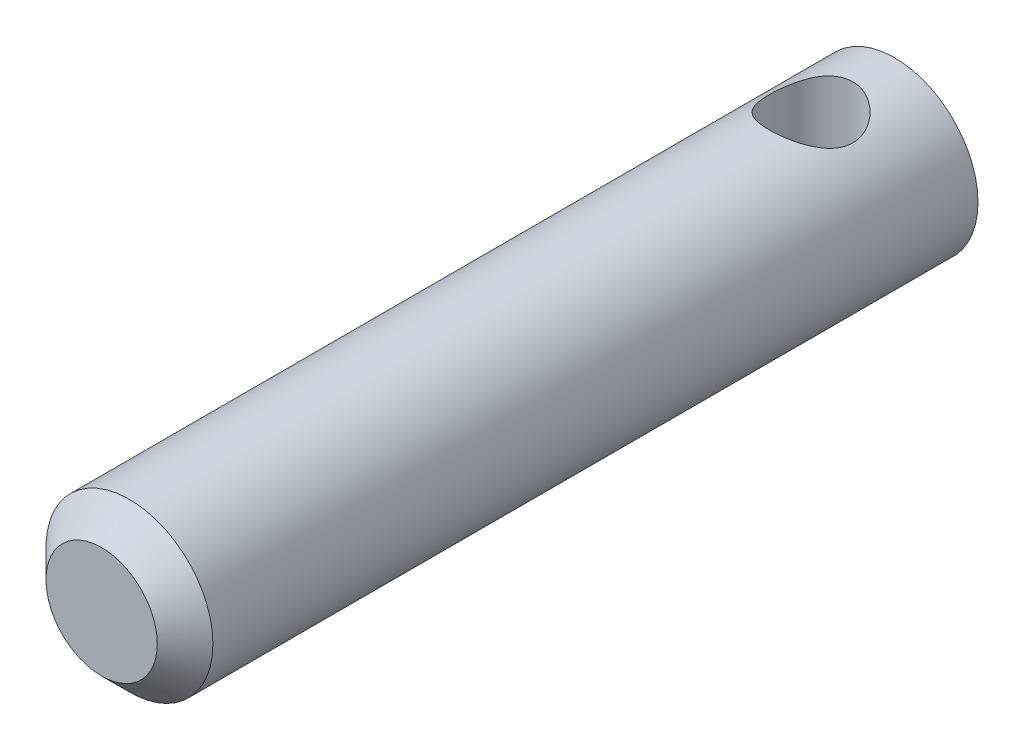
ISO-10303-21;
HEADER;
FILE_DESCRIPTION(('STEP AP214'),'2;1');
FILE_NAME('part.step','',(''),(''),'','','');
FILE_SCHEMA(('AUTOMOTIVE_DESIGN { 1 0 10303 214 1 1 1 1 }'));
ENDSEC;
DATA;
#1=APPLICATION_CONTEXT('core data for automotive mechanical design processes');
#2=APPLICATION_PROTOCOL_DEFINITION('international standard','automotive_design',2000,#1);
#3=PRODUCT_CONTEXT('',#1,'mechanical');
#4=PRODUCT('Part','Part','',(#3));
#5=PRODUCT_RELATED_PRODUCT_CATEGORY('part','',(#4));
#6=PRODUCT_DEFINITION_FORMATION('','',#4);
#7=PRODUCT_DEFINITION_CONTEXT('part definition',#1,'design');
#8=PRODUCT_DEFINITION('design','',#6,#7);
#9=PRODUCT_DEFINITION_SHAPE('','',#8);
#10=(LENGTH_UNIT() NAMED_UNIT(*) SI_UNIT(.MILLI.,.METRE.));
#11=(NAMED_UNIT(*) PLANE_ANGLE_UNIT() SI_UNIT($,.RADIAN.));
#12=(NAMED_UNIT(*) SI_UNIT($,.STERADIAN.) SOLID_ANGLE_UNIT());
#13=UNCERTAINTY_MEASURE_WITH_UNIT(LENGTH_MEASURE(1.E-05),#10,'distance_accuracy_value','');
#14=(GEOMETRIC_REPRESENTATION_CONTEXT(3) GLOBAL_UNCERTAINTY_ASSIGNED_CONTEXT((#13)) GLOBAL_UNIT_ASSIGNED_CONTEXT((#10,
#11,#12)) REPRESENTATION_CONTEXT('',''));
#15=CARTESIAN_POINT('',(0.,0.,0.));
#16=DIRECTION('',(0.,0.,1.));
#17=DIRECTION('',(1.,0.,0.));
#18=AXIS2_PLACEMENT_3D('',#15,#16,#17);
#19=CARTESIAN_POINT('',(0.,0.,28.5));
#20=DIRECTION('',(0.,0.,-1.));
#21=DIRECTION('',(-1.,0.,0.));
#22=AXIS2_PLACEMENT_3D('',#19,#20,#21);
#23=CYLINDRICAL_SURFACE('',#22,3.);
#24=CARTESIAN_POINT('',(0.,0.,27.5));
#25=DIRECTION('',(0.,0.,1.));
#26=DIRECTION('',(1.,0.,0.));
#27=AXIS2_PLACEMENT_3D('',#24,#25,#26);
#28=CIRCLE('',#27,3.);
#29=CARTESIAN_POINT('',(3.,0.,27.5));
#30=VERTEX_POINT('',#29);
#31=EDGE_CURVE('E10',#30,#30,#28,.F.);
#32=ORIENTED_EDGE('',*,*,#31,.T.);
#33=EDGE_LOOP('',(#32));
#34=FACE_BOUND('',#33,.T.);
#35=CARTESIAN_POINT('',(0.,-3.,4.5));
#36=CARTESIAN_POINT('',(0.0788579444268506,-2.99999570107562,4.49999504652421));
#37=CARTESIAN_POINT('',(0.157809899546344,-2.99685736529635,4.49374489031842));
#38=CARTESIAN_POINT('',(0.313380352903344,-2.98461234055736,4.46902067948769));
#39=CARTESIAN_POINT('',(0.389994130070445,-2.97549431743379,4.45052341050328));
#40=CARTESIAN_POINT('',(0.538400317320674,-2.95224419105063,4.40220928707506));
#41=CARTESIAN_POINT('',(0.61021020440872,-2.93813158766306,4.37243642362805));
#42=CARTESIAN_POINT('',(0.747708925209898,-2.90618664773642,4.30264406795252));
#43=CARTESIAN_POINT('',(0.813398240985089,-2.88835460450288,4.2626253836267));
#44=CARTESIAN_POINT('',(0.941261726642864,-2.84934387387093,4.17072412577207));
#45=CARTESIAN_POINT('',(1.00298281668316,-2.82802798691306,4.11827028114054));
#46=CARTESIAN_POINT('',(1.11716916730047,-2.78489955370115,4.00421778112945));
#47=CARTESIAN_POINT('',(1.16962737466015,-2.76308664313552,3.94261222234134));
#48=CARTESIAN_POINT('',(1.26787800067542,-2.71948426796021,3.80627497571493));
#49=CARTESIAN_POINT('',(1.31283800332746,-2.69782780455198,3.73089585248113));
#50=CARTESIAN_POINT('',(1.38925234033604,-2.65928968158481,3.57244899602068));
#51=CARTESIAN_POINT('',(1.4207163224495,-2.64240461410484,3.48938680691588));
#52=CARTESIAN_POINT('',(1.46719866328288,-2.61686800556713,3.32300234186712));
#53=CARTESIAN_POINT('',(1.48308878562066,-2.6077840737557,3.23999332189891));
#54=CARTESIAN_POINT('',(1.50064048996327,-2.59772834922792,3.07203174333078));
#55=CARTESIAN_POINT('',(1.50231613255961,-2.59674854014932,2.98708118869327));
#56=CARTESIAN_POINT('',(1.49203093075844,-2.60266395385873,2.82857096352695));
#57=CARTESIAN_POINT('',(1.48167683930523,-2.6086314549302,2.75486395316542));
#58=CARTESIAN_POINT('',(1.4504097735854,-2.62614343100775,2.61041713594044));
#59=CARTESIAN_POINT('',(1.42949343584648,-2.63768968247664,2.53967828204203));
#60=CARTESIAN_POINT('',(1.37731467057901,-2.66531214619112,2.40115630115151));
#61=CARTESIAN_POINT('',(1.34582260067399,-2.68148760995998,2.33348040182132));
#62=CARTESIAN_POINT('',(1.273562531502,-2.71655106422106,2.20404856111499));
#63=CARTESIAN_POINT('',(1.2327903657187,-2.73544027170286,2.14229529659987));
#64=CARTESIAN_POINT('',(1.13709908236918,-2.77669736854929,2.01821812088516));
#65=CARTESIAN_POINT('',(1.08104168755392,-2.79920265355119,1.95681468963576));
#66=CARTESIAN_POINT('',(0.959333368112061,-2.84321434950611,1.84389687211365));
#67=CARTESIAN_POINT('',(0.893677884861429,-2.86472027938201,1.79238721194918));
#68=CARTESIAN_POINT('',(0.750774758747774,-2.90552980924446,1.69847150845541));
#69=CARTESIAN_POINT('',(0.673130387399114,-2.92468476243011,1.65659929133139));
#70=CARTESIAN_POINT('',(0.510699323233196,-2.95736821681863,1.58685445643549));
#71=CARTESIAN_POINT('',(0.425918364397915,-2.9709011841533,1.55897072247725));
#72=CARTESIAN_POINT('',(0.259149737491054,-2.98986500612153,1.52028689442499));
#73=CARTESIAN_POINT('',(0.17751229582249,-2.99587407451965,1.50826314637983));
#74=CARTESIAN_POINT('',(0.0131693999240285,-3.00109520188655,1.49780290329827));
#75=CARTESIAN_POINT('',(-0.0695355298048621,-3.00031048081978,1.4993599715408));
#76=CARTESIAN_POINT('',(-0.226849457978979,-2.99236788380152,1.51531003262812));
#77=CARTESIAN_POINT('',(-0.301589112074894,-2.98570868532253,1.52869879909499));
#78=CARTESIAN_POINT('',(-0.447610338452911,-2.9673325697226,1.56635710784268));
#79=CARTESIAN_POINT('',(-0.51889152853663,-2.95561509501618,1.59062784968024));
#80=CARTESIAN_POINT('',(-0.658332912674359,-2.92776377120382,1.64999769964955));
#81=CARTESIAN_POINT('',(-0.726345595508705,-2.91151322654446,1.68538657517443));
#82=CARTESIAN_POINT('',(-0.855692042548907,-2.87615961476126,1.76566130346985));
#83=CARTESIAN_POINT('',(-0.917022944664887,-2.85705533350407,1.81055120189309));
#84=CARTESIAN_POINT('',(-1.03765153393382,-2.81562332004297,1.91364063799608));
#85=CARTESIAN_POINT('',(-1.09615811672854,-2.79316327265249,1.97271430266772));
#86=CARTESIAN_POINT('',(-1.20278448167828,-2.7489358741323,2.09988772691659));
#87=CARTESIAN_POINT('',(-1.25089707856781,-2.72716901100071,2.16799367827188));
#88=CARTESIAN_POINT('',(-1.33756187171853,-2.68576788309734,2.31546548125946));
#89=CARTESIAN_POINT('',(-1.37553824370037,-2.66628794383591,2.39521689914172));
#90=CARTESIAN_POINT('',(-1.43712423890206,-2.63361108441202,2.56126510136245));
#91=CARTESIAN_POINT('',(-1.46075237380052,-2.62040607332625,2.64755328970033));
#92=CARTESIAN_POINT('',(-1.49079253120031,-2.60342251538703,2.81536533432706));
#93=CARTESIAN_POINT('',(-1.49863949460818,-2.59886075197597,2.89655138015286));
#94=CARTESIAN_POINT('',(-1.5010337315643,-2.59748031962405,3.05917060074679));
#95=CARTESIAN_POINT('',(-1.49558676993486,-2.60065829439585,3.14060365310679));
#96=CARTESIAN_POINT('',(-1.47288918838996,-2.61356793076615,3.29322525230015));
#97=CARTESIAN_POINT('',(-1.45681247151455,-2.62264641723988,3.36465070521711));
#98=CARTESIAN_POINT('',(-1.41476303733662,-2.64556524281479,3.50371217913655));
#99=CARTESIAN_POINT('',(-1.38878713673988,-2.65940711354503,3.57134697313805));
#100=CARTESIAN_POINT('',(-1.32572361795085,-2.69142795546803,3.7059372764798));
#101=CARTESIAN_POINT('',(-1.28800670672355,-2.70983583593881,3.77254185274354));
#102=CARTESIAN_POINT('',(-1.20322645745609,-2.74852997452291,3.89891180427189));
#103=CARTESIAN_POINT('',(-1.15615825686234,-2.76881720693416,3.95867359578167));
#104=CARTESIAN_POINT('',(-1.04730498999206,-2.81193484737138,4.07721297353201));
#105=CARTESIAN_POINT('',(-0.984426634495892,-2.83477474959942,4.13498865352544));
#106=CARTESIAN_POINT('',(-0.849232209349796,-2.87816628389896,4.2393944751529));
#107=CARTESIAN_POINT('',(-0.776911084957796,-2.89871667939293,4.28601860920486));
#108=CARTESIAN_POINT('',(-0.623897395174418,-2.93547014349806,4.3668545440681));
#109=CARTESIAN_POINT('',(-0.543149255665095,-2.95164144740899,4.4009762538547));
#110=CARTESIAN_POINT('',(-0.376113151707129,-2.9775201194848,4.45471225163611));
#111=CARTESIAN_POINT('',(-0.289841699383649,-2.98724585044602,4.47436777020857));
#112=CARTESIAN_POINT('',(-0.168902919736343,-2.99543192870217,4.49084611662861));
#113=CARTESIAN_POINT('',(-0.135242819162347,-2.99714048010376,4.49427396129951));
#114=CARTESIAN_POINT('',(-0.0677275977076375,-2.99942545465223,4.49885199827113));
#115=CARTESIAN_POINT('',(-0.0338724714699425,-3.00000184655071,4.50000212770531));
#116=CARTESIAN_POINT('',(0.,-3.,4.5));
#117=B_SPLINE_CURVE_WITH_KNOTS('',3,(#35,#36,#37,#38,#39,#40,#41,#42,#43,#44,#45,#46,#47,#48,
#49,#50,#51,#52,#53,#54,#55,#56,#57,#58,#59,#60,#61,#62,#63,#64,#65,#66,#67,#68,#69,#70,#71,#72,
#73,#74,#75,#76,#77,#78,#79,#80,#81,#82,#83,#84,#85,#86,#87,#88,#89,#90,#91,#92,#93,#94,#95,#96,
#97,#98,#99,#100,#101,#102,#103,#104,#105,#106,#107,#108,#109,#110,#111,#112,#113,#114,#115,
#116),.UNSPECIFIED.,.T.,.F.,(4,2,2,2,2,2,2,2,2,2,2,2,2,2,2,2,2,2,2,2,2,2,2,2,2,2,2,2,2,2,2,2,2,
2,2,2,2,2,2,2,4),(0.,0.236436386130439,0.473322224563796,0.709293233238447,0.945245640872351,
1.19547263807713,1.44588935648105,1.71572589646129,1.98536921847421,2.23887018210344,
2.49212035993531,2.71508568613981,2.93812205888518,3.16635360252731,3.39468781890333,
3.65197412000818,3.9093830189803,4.17874533321661,4.44789325368419,4.69474935707018,
4.94148846767214,5.16910359759183,5.39674382446397,5.63089284041848,5.86514176122509,
6.12239415966628,6.37982382923148,6.64972023242589,6.91926767918176,7.1629396125457,
7.40650589797018,7.62686895373284,7.84730293182527,8.08254685170431,8.31791341715446,
8.58187864135757,8.84598575071869,9.1119602049529,9.37717362931724,9.47872920200875,
9.58028757766599),.UNSPECIFIED.);
#118=CARTESIAN_POINT('',(0.,-3.,4.5));
#119=VERTEX_POINT('',#118);
#120=EDGE_CURVE('E44',#119,#119,#117,.T.);
#121=ORIENTED_EDGE('',*,*,#120,.T.);
#122=EDGE_LOOP('',(#121));
#123=FACE_BOUND('',#122,.T.);
#124=CARTESIAN_POINT('',(0.,3.,4.5));
#125=CARTESIAN_POINT('',(-0.0788579444268501,2.99999570107561,4.49999504652421));
#126=CARTESIAN_POINT('',(-0.157809899546344,2.99685736529635,4.49374489031842));
#127=CARTESIAN_POINT('',(-0.313380352903344,2.98461234055736,4.46902067948769));
#128=CARTESIAN_POINT('',(-0.389994130070444,2.97549431743379,4.45052341050328));
#129=CARTESIAN_POINT('',(-0.538400317320673,2.95224419105063,4.40220928707506));
#130=CARTESIAN_POINT('',(-0.610210204408719,2.93813158766306,4.37243642362805));
#131=CARTESIAN_POINT('',(-0.747708925209898,2.90618664773642,4.30264406795252));
#132=CARTESIAN_POINT('',(-0.813398240985089,2.88835460450288,4.2626253836267));
#133=CARTESIAN_POINT('',(-0.941261726642864,2.84934387387093,4.17072412577207));
#134=CARTESIAN_POINT('',(-1.00298281668316,2.82802798691306,4.11827028114054));
#135=CARTESIAN_POINT('',(-1.11716916730047,2.78489955370115,4.00421778112945));
#136=CARTESIAN_POINT('',(-1.16962737466015,2.76308664313552,3.94261222234134));
#137=CARTESIAN_POINT('',(-1.26787800067542,2.71948426796021,3.80627497571493));
#138=CARTESIAN_POINT('',(-1.31283800332746,2.69782780455198,3.73089585248113));
#139=CARTESIAN_POINT('',(-1.38925234033604,2.65928968158481,3.57244899602068));
#140=CARTESIAN_POINT('',(-1.4207163224495,2.64240461410484,3.48938680691588));
#141=CARTESIAN_POINT('',(-1.46719866328288,2.61686800556713,3.32300234186712));
#142=CARTESIAN_POINT('',(-1.48308878562066,2.6077840737557,3.23999332189891));
#143=CARTESIAN_POINT('',(-1.50064048996327,2.59772834922792,3.07203174333078));
#144=CARTESIAN_POINT('',(-1.50231613255961,2.59674854014932,2.98708118869327));
#145=CARTESIAN_POINT('',(-1.49203093075844,2.60266395385873,2.82857096352695));
#146=CARTESIAN_POINT('',(-1.48167683930523,2.6086314549302,2.75486395316542));
#147=CARTESIAN_POINT('',(-1.4504097735854,2.62614343100776,2.61041713594044));
#148=CARTESIAN_POINT('',(-1.42949343584648,2.63768968247664,2.53967828204203));
#149=CARTESIAN_POINT('',(-1.377314670579,2.66531214619112,2.40115630115151));
#150=CARTESIAN_POINT('',(-1.34582260067399,2.68148760995998,2.33348040182132));
#151=CARTESIAN_POINT('',(-1.273562531502,2.71655106422106,2.20404856111499));
#152=CARTESIAN_POINT('',(-1.2327903657187,2.73544027170286,2.14229529659987));
#153=CARTESIAN_POINT('',(-1.13709908236918,2.77669736854929,2.01821812088516));
#154=CARTESIAN_POINT('',(-1.08104168755392,2.79920265355119,1.95681468963576));
#155=CARTESIAN_POINT('',(-0.95933336811206,2.84321434950611,1.84389687211365));
#156=CARTESIAN_POINT('',(-0.893677884861428,2.86472027938201,1.79238721194918));
#157=CARTESIAN_POINT('',(-0.750774758747773,2.90552980924446,1.69847150845541));
#158=CARTESIAN_POINT('',(-0.673130387399113,2.92468476243011,1.65659929133139));
#159=CARTESIAN_POINT('',(-0.510699323233195,2.95736821681863,1.58685445643549));
#160=CARTESIAN_POINT('',(-0.425918364397914,2.9709011841533,1.55897072247725));
#161=CARTESIAN_POINT('',(-0.259149737491053,2.98986500612153,1.52028689442499));
#162=CARTESIAN_POINT('',(-0.177512295822489,2.99587407451965,1.50826314637983));
#163=CARTESIAN_POINT('',(-0.0131693999240274,3.00109520188655,1.49780290329827));
#164=CARTESIAN_POINT('',(0.0695355298048632,3.00031048081978,1.4993599715408));
#165=CARTESIAN_POINT('',(0.22684945797898,2.99236788380152,1.51531003262812));
#166=CARTESIAN_POINT('',(0.301589112074895,2.98570868532253,1.52869879909499));
#167=CARTESIAN_POINT('',(0.447610338452912,2.9673325697226,1.56635710784268));
#168=CARTESIAN_POINT('',(0.518891528536631,2.95561509501618,1.59062784968024));
#169=CARTESIAN_POINT('',(0.65833291267436,2.92776377120382,1.64999769964955));
#170=CARTESIAN_POINT('',(0.726345595508706,2.91151322654446,1.68538657517443));
#171=CARTESIAN_POINT('',(0.855692042548908,2.87615961476126,1.76566130346985));
#172=CARTESIAN_POINT('',(0.917022944664889,2.85705533350407,1.81055120189309));
#173=CARTESIAN_POINT('',(1.03765153393382,2.81562332004297,1.91364063799608));
#174=CARTESIAN_POINT('',(1.09615811672854,2.79316327265249,1.97271430266772));
#175=CARTESIAN_POINT('',(1.20278448167828,2.7489358741323,2.09988772691659));
#176=CARTESIAN_POINT('',(1.25089707856781,2.72716901100071,2.16799367827188));
#177=CARTESIAN_POINT('',(1.33756187171853,2.68576788309734,2.31546548125946));
#178=CARTESIAN_POINT('',(1.37553824370037,2.66628794383591,2.39521689914172));
#179=CARTESIAN_POINT('',(1.43712423890206,2.63361108441202,2.56126510136245));
#180=CARTESIAN_POINT('',(1.46075237380053,2.62040607332625,2.64755328970034));
#181=CARTESIAN_POINT('',(1.49079253120031,2.60342251538703,2.81536533432706));
#182=CARTESIAN_POINT('',(1.49863949460818,2.59886075197597,2.89655138015286));
#183=CARTESIAN_POINT('',(1.5010337315643,2.59748031962405,3.05917060074679));
#184=CARTESIAN_POINT('',(1.49558676993486,2.60065829439585,3.14060365310679));
#185=CARTESIAN_POINT('',(1.47288918838997,2.61356793076615,3.29322525230016));
#186=CARTESIAN_POINT('',(1.45681247151455,2.62264641723988,3.36465070521711));
#187=CARTESIAN_POINT('',(1.41476303733662,2.64556524281479,3.50371217913655));
#188=CARTESIAN_POINT('',(1.38878713673988,2.65940711354503,3.57134697313805));
#189=CARTESIAN_POINT('',(1.32572361795085,2.69142795546804,3.7059372764798));
#190=CARTESIAN_POINT('',(1.28800670672355,2.70983583593881,3.77254185274354));
#191=CARTESIAN_POINT('',(1.20322645745609,2.74852997452291,3.89891180427189));
#192=CARTESIAN_POINT('',(1.15615825686234,2.76881720693416,3.95867359578167));
#193=CARTESIAN_POINT('',(1.04730498999206,2.81193484737138,4.07721297353201));
#194=CARTESIAN_POINT('',(0.984426634495893,2.83477474959942,4.13498865352544));
#195=CARTESIAN_POINT('',(0.849232209349796,2.87816628389896,4.2393944751529));
#196=CARTESIAN_POINT('',(0.776911084957796,2.89871667939293,4.28601860920486));
#197=CARTESIAN_POINT('',(0.623897395174418,2.93547014349806,4.36685454406811));
#198=CARTESIAN_POINT('',(0.543149255665095,2.95164144740899,4.4009762538547));
#199=CARTESIAN_POINT('',(0.376113151707129,2.9775201194848,4.45471225163611));
#200=CARTESIAN_POINT('',(0.289841699383649,2.98724585044602,4.47436777020857));
#201=CARTESIAN_POINT('',(0.168902919736342,2.99543192870217,4.49084611662861));
#202=CARTESIAN_POINT('',(0.135242819162347,2.99714048010376,4.49427396129951));
#203=CARTESIAN_POINT('',(0.0677275977076371,2.99942545465223,4.49885199827113));
#204=CARTESIAN_POINT('',(0.0338724714699425,3.00000184655071,4.50000212770531));
#205=CARTESIAN_POINT('',(0.,3.,4.5));
#206=B_SPLINE_CURVE_WITH_KNOTS('',3,(#124,#125,#126,#127,#128,#129,#130,#131,#132,#133,#134,
#135,#136,#137,#138,#139,#140,#141,#142,#143,#144,#145,#146,#147,#148,#149,#150,#151,#152,#153,
#154,#155,#156,#157,#158,#159,#160,#161,#162,#163,#164,#165,#166,#167,#168,#169,#170,#171,#172,
#173,#174,#175,#176,#177,#178,#179,#180,#181,#182,#183,#184,#185,#186,#187,#188,#189,#190,#191,
#192,#193,#194,#195,#196,#197,#198,#199,#200,#201,#202,#203,#204,#205),.UNSPECIFIED.,.T.,.F.,(4,
2,2,2,2,2,2,2,2,2,2,2,2,2,2,2,2,2,2,2,2,2,2,2,2,2,2,2,2,2,2,2,2,2,2,2,2,2,2,2,4),(0.,
0.236436386130439,0.473322224563796,0.709293233238447,0.945245640872351,1.19547263807713,
1.44588935648105,1.71572589646129,1.98536921847421,2.23887018210344,2.49212035993531,
2.71508568613981,2.93812205888518,3.16635360252731,3.39468781890333,3.65197412000818,
3.90938301898029,4.17874533321661,4.44789325368419,4.69474935707018,4.94148846767214,
5.16910359759183,5.39674382446397,5.63089284041848,5.86514176122509,6.12239415966629,
6.37982382923148,6.64972023242589,6.91926767918176,7.1629396125457,7.40650589797018,
7.62686895373284,7.84730293182527,8.08254685170431,8.31791341715446,8.58187864135757,
8.84598575071869,9.1119602049529,9.37717362931724,9.47872920200876,9.58028757766599),.UNSPECIFIED.);
#207=CARTESIAN_POINT('',(0.,3.,4.5));
#208=VERTEX_POINT('',#207);
#209=EDGE_CURVE('E48',#208,#208,#206,.T.);
#210=ORIENTED_EDGE('',*,*,#209,.T.);
#211=EDGE_LOOP('',(#210));
#212=FACE_BOUND('',#211,.T.);
#213=CARTESIAN_POINT('',(0.,0.,0.));
#214=DIRECTION('',(0.,0.,1.));
#215=DIRECTION('',(1.,0.,0.));
#216=AXIS2_PLACEMENT_3D('',#213,#214,#215);
#217=CIRCLE('',#216,3.);
#218=CARTESIAN_POINT('',(3.,0.,0.));
#219=VERTEX_POINT('',#218);
#220=EDGE_CURVE('E83',#219,#219,#217,.T.);
#221=ORIENTED_EDGE('',*,*,#220,.T.);
#222=EDGE_LOOP('',(#221));
#223=FACE_BOUND('',#222,.T.);
#224=ADVANCED_FACE('F33',(#34,#123,#212,#223),#23,.T.);
#225=CARTESIAN_POINT('',(0.,0.,28.5));
#226=DIRECTION('',(0.,0.,1.));
#227=DIRECTION('',(1.,0.,0.));
#228=AXIS2_PLACEMENT_3D('',#225,#226,#227);
#229=PLANE('',#228);
#230=CARTESIAN_POINT('',(0.,0.,28.5));
#231=DIRECTION('',(0.,0.,1.));
#232=DIRECTION('',(1.,0.,0.));
#233=AXIS2_PLACEMENT_3D('',#230,#231,#232);
#234=CIRCLE('',#233,2.00000000000001);
#235=CARTESIAN_POINT('',(2.00000000000001,0.,28.5));
#236=VERTEX_POINT('',#235);
#237=EDGE_CURVE('E40',#236,#236,#234,.T.);
#238=ORIENTED_EDGE('',*,*,#237,.T.);
#239=EDGE_LOOP('',(#238));
#240=FACE_BOUND('',#239,.T.);
#241=ADVANCED_FACE('F65',(#240),#229,.T.);
#242=CARTESIAN_POINT('',(0.,0.,0.));
#243=DIRECTION('',(0.,0.,1.));
#244=DIRECTION('',(1.,0.,0.));
#245=AXIS2_PLACEMENT_3D('',#242,#243,#244);
#246=PLANE('',#245);
#247=ORIENTED_EDGE('',*,*,#220,.F.);
#248=EDGE_LOOP('',(#247));
#249=FACE_BOUND('',#248,.T.);
#250=ADVANCED_FACE('F63',(#249),#246,.F.);
#251=CARTESIAN_POINT('',(0.,-3.,3.));
#252=DIRECTION('',(0.,1.,0.));
#253=DIRECTION('',(0.,0.,1.));
#254=AXIS2_PLACEMENT_3D('',#251,#252,#253);
#255=CYLINDRICAL_SURFACE('',#254,1.5);
#256=ORIENTED_EDGE('',*,*,#209,.F.);
#257=EDGE_LOOP('',(#256));
#258=FACE_BOUND('',#257,.T.);
#259=ORIENTED_EDGE('',*,*,#120,.F.);
#260=EDGE_LOOP('',(#259));
#261=FACE_BOUND('',#260,.T.);
#262=ADVANCED_FACE('F59',(#258,#261),#255,.F.);
#263=CARTESIAN_POINT('',(0.,0.,28.5));
#264=DIRECTION('',(0.,0.,-1.));
#265=DIRECTION('',(-1.,0.,0.));
#266=AXIS2_PLACEMENT_3D('',#263,#264,#265);
#267=CONICAL_SURFACE('',#266,2.00000000000001,0.785398163397446);
#268=ORIENTED_EDGE('',*,*,#31,.F.);
#269=EDGE_LOOP('',(#268));
#270=FACE_BOUND('',#269,.T.);
#271=ORIENTED_EDGE('',*,*,#237,.F.);
#272=EDGE_LOOP('',(#271));
#273=FACE_BOUND('',#272,.T.);
#274=ADVANCED_FACE('F35',(#270,#273),#267,.T.);
#275=CLOSED_SHELL('',(#224,#241,#250,#262,#274));
#276=MANIFOLD_SOLID_BREP('B2',#275);
#277=ADVANCED_BREP_SHAPE_REPRESENTATION('',(#18,#276),#14);
#278=SHAPE_DEFINITION_REPRESENTATION(#9,#277);
ENDSEC;
END-ISO-10303-21;
